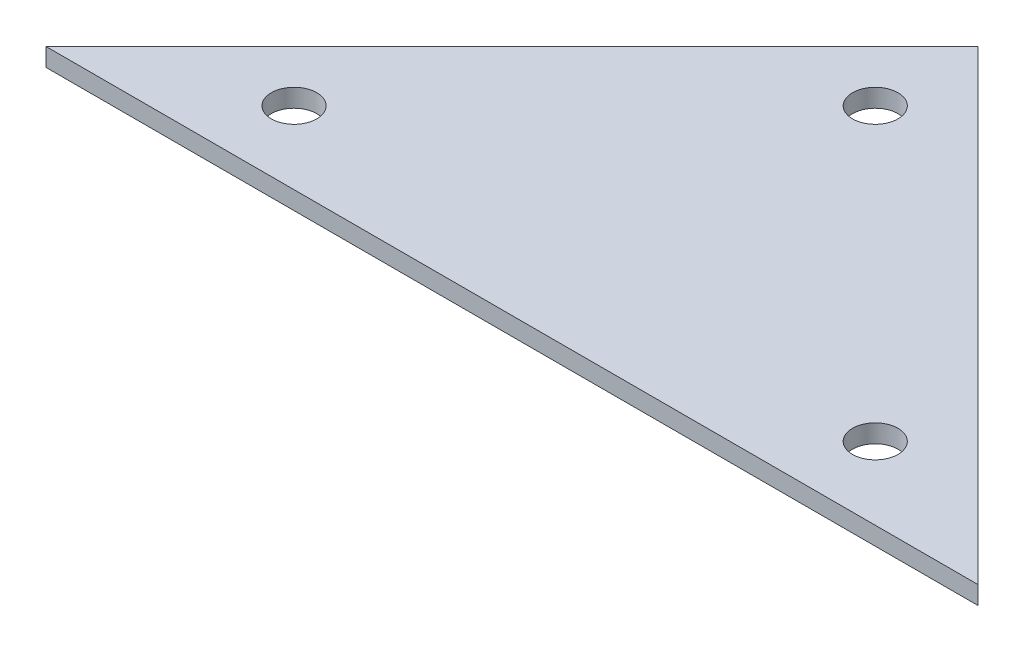
ISO-10303-21;
HEADER;
FILE_DESCRIPTION(('STEP AP214'),'2;1');
FILE_NAME('part.step','',(''),(''),'','','');
FILE_SCHEMA(('AUTOMOTIVE_DESIGN { 1 0 10303 214 1 1 1 1 }'));
ENDSEC;
DATA;
#1=APPLICATION_CONTEXT('core data for automotive mechanical design processes');
#2=APPLICATION_PROTOCOL_DEFINITION('international standard','automotive_design',2000,#1);
#3=PRODUCT_CONTEXT('',#1,'mechanical');
#4=PRODUCT('Part','Part','',(#3));
#5=PRODUCT_RELATED_PRODUCT_CATEGORY('part','',(#4));
#6=PRODUCT_DEFINITION_FORMATION('','',#4);
#7=PRODUCT_DEFINITION_CONTEXT('part definition',#1,'design');
#8=PRODUCT_DEFINITION('design','',#6,#7);
#9=PRODUCT_DEFINITION_SHAPE('','',#8);
#10=(LENGTH_UNIT() NAMED_UNIT(*) SI_UNIT(.MILLI.,.METRE.));
#11=(NAMED_UNIT(*) PLANE_ANGLE_UNIT() SI_UNIT($,.RADIAN.));
#12=(NAMED_UNIT(*) SI_UNIT($,.STERADIAN.) SOLID_ANGLE_UNIT());
#13=UNCERTAINTY_MEASURE_WITH_UNIT(LENGTH_MEASURE(1.E-05),#10,'distance_accuracy_value','');
#14=(GEOMETRIC_REPRESENTATION_CONTEXT(3) GLOBAL_UNCERTAINTY_ASSIGNED_CONTEXT((#13)) GLOBAL_UNIT_ASSIGNED_CONTEXT((#10,
#11,#12)) REPRESENTATION_CONTEXT('',''));
#15=CARTESIAN_POINT('',(0.,0.,0.));
#16=DIRECTION('',(0.,0.,1.));
#17=DIRECTION('',(1.,0.,0.));
#18=AXIS2_PLACEMENT_3D('',#15,#16,#17);
#19=CARTESIAN_POINT('',(0.,1.5875,0.));
#20=DIRECTION('',(0.,1.,0.));
#21=DIRECTION('',(0.,0.,1.));
#22=AXIS2_PLACEMENT_3D('',#19,#20,#21);
#23=PLANE('',#22);
#24=CARTESIAN_POINT('',(0.,1.5875,-50.8));
#25=DIRECTION('',(0.,1.,0.));
#26=DIRECTION('',(0.,0.,1.));
#27=AXIS2_PLACEMENT_3D('',#24,#25,#26);
#28=CIRCLE('',#27,3.96875);
#29=CARTESIAN_POINT('',(0.,1.5875,-46.83125));
#30=VERTEX_POINT('',#29);
#31=EDGE_CURVE('E114',#30,#30,#28,.T.);
#32=ORIENTED_EDGE('',*,*,#31,.F.);
#33=EDGE_LOOP('',(#32));
#34=FACE_BOUND('',#33,.T.);
#35=DIRECTION('',(-0.707106781186547,0.,-0.707106781186548));
#36=VECTOR('',#35,1.);
#37=CARTESIAN_POINT('',(81.4605122421383,1.5875,12.7));
#38=LINE('',#37,#36);
#39=CARTESIAN_POINT('',(81.4605122421383,1.5875,12.7));
#40=VERTEX_POINT('',#39);
#41=CARTESIAN_POINT('',(0.,1.5875,-68.7605122421383));
#42=VERTEX_POINT('',#41);
#43=EDGE_CURVE('E74',#40,#42,#38,.T.);
#44=ORIENTED_EDGE('',*,*,#43,.T.);
#45=DIRECTION('',(-0.707106781186547,0.,0.707106781186548));
#46=VECTOR('',#45,1.);
#47=CARTESIAN_POINT('',(0.,1.5875,-68.7605122421383));
#48=LINE('',#47,#46);
#49=CARTESIAN_POINT('',(-81.4605122421383,1.5875,12.7));
#50=VERTEX_POINT('',#49);
#51=EDGE_CURVE('E70',#42,#50,#48,.T.);
#52=ORIENTED_EDGE('',*,*,#51,.T.);
#53=DIRECTION('',(1.,0.,0.));
#54=VECTOR('',#53,1.);
#55=CARTESIAN_POINT('',(-81.4605122421383,1.5875,12.7));
#56=LINE('',#55,#54);
#57=EDGE_CURVE('E50',#50,#40,#56,.T.);
#58=ORIENTED_EDGE('',*,*,#57,.T.);
#59=EDGE_LOOP('',(#44,#52,#58));
#60=FACE_BOUND('',#59,.T.);
#61=CARTESIAN_POINT('',(-50.8,1.5875,0.));
#62=DIRECTION('',(0.,1.,0.));
#63=DIRECTION('',(0.,0.,1.));
#64=AXIS2_PLACEMENT_3D('',#61,#62,#63);
#65=CIRCLE('',#64,3.96875);
#66=CARTESIAN_POINT('',(-50.8,1.5875,3.96875));
#67=VERTEX_POINT('',#66);
#68=EDGE_CURVE('E84',#67,#67,#65,.T.);
#69=ORIENTED_EDGE('',*,*,#68,.F.);
#70=EDGE_LOOP('',(#69));
#71=FACE_BOUND('',#70,.T.);
#72=CARTESIAN_POINT('',(50.8,1.5875,0.));
#73=DIRECTION('',(0.,1.,0.));
#74=DIRECTION('',(0.,0.,1.));
#75=AXIS2_PLACEMENT_3D('',#72,#73,#74);
#76=CIRCLE('',#75,3.96875);
#77=CARTESIAN_POINT('',(50.8,1.5875,3.96875));
#78=VERTEX_POINT('',#77);
#79=EDGE_CURVE('E109',#78,#78,#76,.T.);
#80=ORIENTED_EDGE('',*,*,#79,.F.);
#81=EDGE_LOOP('',(#80));
#82=FACE_BOUND('',#81,.T.);
#83=ADVANCED_FACE('F33',(#34,#60,#71,#82),#23,.T.);
#84=CARTESIAN_POINT('',(0.,-1.5875,0.));
#85=DIRECTION('',(0.,1.,0.));
#86=DIRECTION('',(0.,0.,1.));
#87=AXIS2_PLACEMENT_3D('',#84,#85,#86);
#88=PLANE('',#87);
#89=DIRECTION('',(-0.707106781186547,0.,-0.707106781186548));
#90=VECTOR('',#89,1.);
#91=CARTESIAN_POINT('',(81.4605122421383,-1.5875,12.7));
#92=LINE('',#91,#90);
#93=CARTESIAN_POINT('',(81.4605122421383,-1.5875,12.7));
#94=VERTEX_POINT('',#93);
#95=CARTESIAN_POINT('',(0.,-1.5875,-68.7605122421383));
#96=VERTEX_POINT('',#95);
#97=EDGE_CURVE('E81',#94,#96,#92,.T.);
#98=ORIENTED_EDGE('',*,*,#97,.F.);
#99=DIRECTION('',(1.,0.,0.));
#100=VECTOR('',#99,1.);
#101=CARTESIAN_POINT('',(-81.4605122421383,-1.5875,12.7));
#102=LINE('',#101,#100);
#103=CARTESIAN_POINT('',(-81.4605122421383,-1.5875,12.7));
#104=VERTEX_POINT('',#103);
#105=EDGE_CURVE('E67',#104,#94,#102,.T.);
#106=ORIENTED_EDGE('',*,*,#105,.F.);
#107=DIRECTION('',(-0.707106781186547,0.,0.707106781186548));
#108=VECTOR('',#107,1.);
#109=CARTESIAN_POINT('',(0.,-1.5875,-68.7605122421383));
#110=LINE('',#109,#108);
#111=EDGE_CURVE('E62',#96,#104,#110,.T.);
#112=ORIENTED_EDGE('',*,*,#111,.F.);
#113=EDGE_LOOP('',(#98,#106,#112));
#114=FACE_BOUND('',#113,.T.);
#115=CARTESIAN_POINT('',(-50.8,-1.5875,0.));
#116=DIRECTION('',(0.,1.,0.));
#117=DIRECTION('',(0.,0.,1.));
#118=AXIS2_PLACEMENT_3D('',#115,#116,#117);
#119=CIRCLE('',#118,3.96875);
#120=CARTESIAN_POINT('',(-50.8,-1.5875,3.96875));
#121=VERTEX_POINT('',#120);
#122=EDGE_CURVE('E88',#121,#121,#119,.T.);
#123=ORIENTED_EDGE('',*,*,#122,.T.);
#124=EDGE_LOOP('',(#123));
#125=FACE_BOUND('',#124,.T.);
#126=CARTESIAN_POINT('',(0.,-1.5875,-50.8));
#127=DIRECTION('',(0.,1.,0.));
#128=DIRECTION('',(0.,0.,1.));
#129=AXIS2_PLACEMENT_3D('',#126,#127,#128);
#130=CIRCLE('',#129,3.96875);
#131=CARTESIAN_POINT('',(0.,-1.5875,-46.83125));
#132=VERTEX_POINT('',#131);
#133=EDGE_CURVE('E104',#132,#132,#130,.T.);
#134=ORIENTED_EDGE('',*,*,#133,.T.);
#135=EDGE_LOOP('',(#134));
#136=FACE_BOUND('',#135,.T.);
#137=CARTESIAN_POINT('',(50.8,-1.5875,0.));
#138=DIRECTION('',(0.,1.,0.));
#139=DIRECTION('',(0.,0.,1.));
#140=AXIS2_PLACEMENT_3D('',#137,#138,#139);
#141=CIRCLE('',#140,3.96875);
#142=CARTESIAN_POINT('',(50.8,-1.5875,3.96875));
#143=VERTEX_POINT('',#142);
#144=EDGE_CURVE('E107',#143,#143,#141,.T.);
#145=ORIENTED_EDGE('',*,*,#144,.T.);
#146=EDGE_LOOP('',(#145));
#147=FACE_BOUND('',#146,.T.);
#148=ADVANCED_FACE('F94',(#114,#125,#136,#147),#88,.F.);
#149=CARTESIAN_POINT('',(81.4605122421383,1.5875,12.7));
#150=DIRECTION('',(-0.707106781186548,0.,0.707106781186547));
#151=DIRECTION('',(0.707106781186547,0.,0.707106781186548));
#152=AXIS2_PLACEMENT_3D('',#149,#150,#151);
#153=PLANE('',#152);
#154=ORIENTED_EDGE('',*,*,#97,.T.);
#155=DIRECTION('',(0.,-1.,0.));
#156=VECTOR('',#155,1.);
#157=CARTESIAN_POINT('',(0.,1.5875,-68.7605122421383));
#158=LINE('',#157,#156);
#159=EDGE_CURVE('E11',#42,#96,#158,.T.);
#160=ORIENTED_EDGE('',*,*,#159,.F.);
#161=ORIENTED_EDGE('',*,*,#43,.F.);
#162=DIRECTION('',(0.,-1.,0.));
#163=VECTOR('',#162,1.);
#164=CARTESIAN_POINT('',(81.4605122421383,1.5875,12.7));
#165=LINE('',#164,#163);
#166=EDGE_CURVE('E82',#40,#94,#165,.T.);
#167=ORIENTED_EDGE('',*,*,#166,.T.);
#168=EDGE_LOOP('',(#154,#160,#161,#167));
#169=FACE_BOUND('',#168,.T.);
#170=ADVANCED_FACE('F35',(#169),#153,.F.);
#171=CARTESIAN_POINT('',(0.,1.5875,-68.7605122421383));
#172=DIRECTION('',(0.707106781186548,0.,0.707106781186547));
#173=DIRECTION('',(0.707106781186547,0.,-0.707106781186548));
#174=AXIS2_PLACEMENT_3D('',#171,#172,#173);
#175=PLANE('',#174);
#176=ORIENTED_EDGE('',*,*,#111,.T.);
#177=DIRECTION('',(0.,-1.,0.));
#178=VECTOR('',#177,1.);
#179=CARTESIAN_POINT('',(-81.4605122421383,1.5875,12.7));
#180=LINE('',#179,#178);
#181=EDGE_CURVE('E42',#50,#104,#180,.T.);
#182=ORIENTED_EDGE('',*,*,#181,.F.);
#183=ORIENTED_EDGE('',*,*,#51,.F.);
#184=ORIENTED_EDGE('',*,*,#159,.T.);
#185=EDGE_LOOP('',(#176,#182,#183,#184));
#186=FACE_BOUND('',#185,.T.);
#187=ADVANCED_FACE('F71',(#186),#175,.F.);
#188=CARTESIAN_POINT('',(-81.4605122421383,1.5875,12.7));
#189=DIRECTION('',(0.,0.,-1.));
#190=DIRECTION('',(-1.,0.,0.));
#191=AXIS2_PLACEMENT_3D('',#188,#189,#190);
#192=PLANE('',#191);
#193=ORIENTED_EDGE('',*,*,#105,.T.);
#194=ORIENTED_EDGE('',*,*,#166,.F.);
#195=ORIENTED_EDGE('',*,*,#57,.F.);
#196=ORIENTED_EDGE('',*,*,#181,.T.);
#197=EDGE_LOOP('',(#193,#194,#195,#196));
#198=FACE_BOUND('',#197,.T.);
#199=ADVANCED_FACE('F93',(#198),#192,.F.);
#200=CARTESIAN_POINT('',(-50.8,1.5875,0.));
#201=DIRECTION('',(0.,-1.,0.));
#202=DIRECTION('',(0.,0.,-1.));
#203=AXIS2_PLACEMENT_3D('',#200,#201,#202);
#204=CYLINDRICAL_SURFACE('',#203,3.96875);
#205=ORIENTED_EDGE('',*,*,#68,.T.);
#206=EDGE_LOOP('',(#205));
#207=FACE_BOUND('',#206,.T.);
#208=ORIENTED_EDGE('',*,*,#122,.F.);
#209=EDGE_LOOP('',(#208));
#210=FACE_BOUND('',#209,.T.);
#211=ADVANCED_FACE('F128',(#207,#210),#204,.F.);
#212=CARTESIAN_POINT('',(0.,1.5875,-50.8));
#213=DIRECTION('',(0.,-1.,0.));
#214=DIRECTION('',(0.,0.,-1.));
#215=AXIS2_PLACEMENT_3D('',#212,#213,#214);
#216=CYLINDRICAL_SURFACE('',#215,3.96875);
#217=ORIENTED_EDGE('',*,*,#31,.T.);
#218=EDGE_LOOP('',(#217));
#219=FACE_BOUND('',#218,.T.);
#220=ORIENTED_EDGE('',*,*,#133,.F.);
#221=EDGE_LOOP('',(#220));
#222=FACE_BOUND('',#221,.T.);
#223=ADVANCED_FACE('F120',(#219,#222),#216,.F.);
#224=CARTESIAN_POINT('',(50.8,1.5875,0.));
#225=DIRECTION('',(0.,-1.,0.));
#226=DIRECTION('',(0.,0.,-1.));
#227=AXIS2_PLACEMENT_3D('',#224,#225,#226);
#228=CYLINDRICAL_SURFACE('',#227,3.96875);
#229=ORIENTED_EDGE('',*,*,#79,.T.);
#230=EDGE_LOOP('',(#229));
#231=FACE_BOUND('',#230,.T.);
#232=ORIENTED_EDGE('',*,*,#144,.F.);
#233=EDGE_LOOP('',(#232));
#234=FACE_BOUND('',#233,.T.);
#235=ADVANCED_FACE('F174',(#231,#234),#228,.F.);
#236=CLOSED_SHELL('',(#83,#148,#170,#187,#199,#211,#223,#235));
#237=MANIFOLD_SOLID_BREP('B2',#236);
#238=ADVANCED_BREP_SHAPE_REPRESENTATION('',(#18,#237),#14);
#239=SHAPE_DEFINITION_REPRESENTATION(#9,#238);
ENDSEC;
END-ISO-10303-21;
